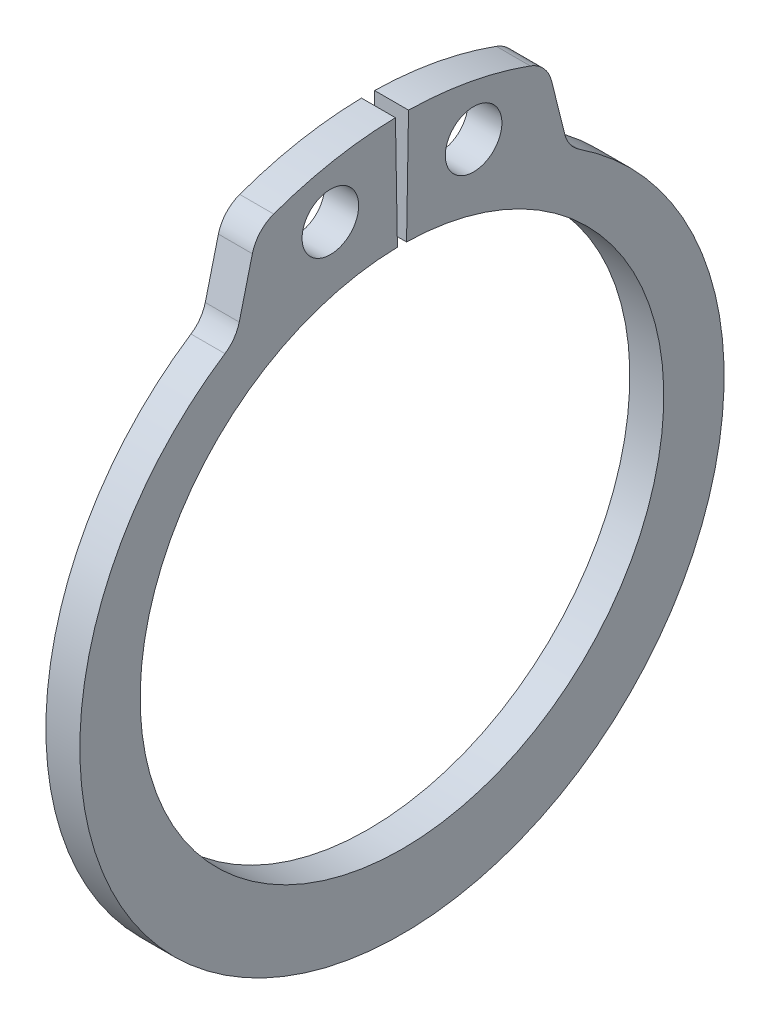
ISO-10303-21;
HEADER;
FILE_DESCRIPTION(('STEP AP214'),'2;1');
FILE_NAME('part.step','',(''),(''),'','','');
FILE_SCHEMA(('AUTOMOTIVE_DESIGN { 1 0 10303 214 1 1 1 1 }'));
ENDSEC;
DATA;
#1=APPLICATION_CONTEXT('core data for automotive mechanical design processes');
#2=APPLICATION_PROTOCOL_DEFINITION('international standard','automotive_design',2000,#1);
#3=PRODUCT_CONTEXT('',#1,'mechanical');
#4=PRODUCT('Part','Part','',(#3));
#5=PRODUCT_RELATED_PRODUCT_CATEGORY('part','',(#4));
#6=PRODUCT_DEFINITION_FORMATION('','',#4);
#7=PRODUCT_DEFINITION_CONTEXT('part definition',#1,'design');
#8=PRODUCT_DEFINITION('design','',#6,#7);
#9=PRODUCT_DEFINITION_SHAPE('','',#8);
#10=(LENGTH_UNIT() NAMED_UNIT(*) SI_UNIT(.MILLI.,.METRE.));
#11=(NAMED_UNIT(*) PLANE_ANGLE_UNIT() SI_UNIT($,.RADIAN.));
#12=(NAMED_UNIT(*) SI_UNIT($,.STERADIAN.) SOLID_ANGLE_UNIT());
#13=UNCERTAINTY_MEASURE_WITH_UNIT(LENGTH_MEASURE(1.E-05),#10,'distance_accuracy_value','');
#14=(GEOMETRIC_REPRESENTATION_CONTEXT(3) GLOBAL_UNCERTAINTY_ASSIGNED_CONTEXT((#13)) GLOBAL_UNIT_ASSIGNED_CONTEXT((#10,
#11,#12)) REPRESENTATION_CONTEXT('',''));
#15=CARTESIAN_POINT('',(0.,0.,0.));
#16=DIRECTION('',(0.,0.,1.));
#17=DIRECTION('',(1.,0.,0.));
#18=AXIS2_PLACEMENT_3D('',#15,#16,#17);
#19=CARTESIAN_POINT('',(0.6,0.,0.));
#20=DIRECTION('',(1.,0.,0.));
#21=DIRECTION('',(0.,0.,-1.));
#22=AXIS2_PLACEMENT_3D('',#19,#20,#21);
#23=PLANE('',#22);
#24=CARTESIAN_POINT('',(0.6,11.2075498339008,2.53014564968776));
#25=DIRECTION('',(1.,0.,0.));
#26=DIRECTION('',(0.,0.,-1.));
#27=AXIS2_PLACEMENT_3D('',#24,#25,#26);
#28=CIRCLE('',#27,1.);
#29=CARTESIAN_POINT('',(0.6,11.2075498339008,1.53014564968776));
#30=VERTEX_POINT('',#29);
#31=EDGE_CURVE('E217',#30,#30,#28,.T.);
#32=ORIENTED_EDGE('',*,*,#31,.F.);
#33=EDGE_LOOP('',(#32));
#34=FACE_BOUND('',#33,.T.);
#35=CARTESIAN_POINT('',(0.6,0.,0.));
#36=DIRECTION('',(1.,0.,0.));
#37=DIRECTION('',(0.,0.,-1.));
#38=AXIS2_PLACEMENT_3D('',#35,#36,#37);
#39=CIRCLE('',#38,13.25);
#40=CARTESIAN_POINT('',(0.6,13.2479819608222,0.231244385294007));
#41=VERTEX_POINT('',#40);
#42=CARTESIAN_POINT('',(0.6,12.4507767148435,4.53218040209241));
#43=VERTEX_POINT('',#42);
#44=EDGE_CURVE('E134',#41,#43,#39,.T.);
#45=ORIENTED_EDGE('',*,*,#44,.T.);
#46=CARTESIAN_POINT('',(0.6,11.3231592010464,4.12171878077083));
#47=DIRECTION('',(1.,0.,0.));
#48=DIRECTION('',(0.,0.,-1.));
#49=AXIS2_PLACEMENT_3D('',#46,#47,#48);
#50=CIRCLE('',#49,1.2);
#51=CARTESIAN_POINT('',(0.6,11.613465475766,5.28607365230203));
#52=VERTEX_POINT('',#51);
#53=EDGE_CURVE('E171',#43,#52,#50,.T.);
#54=ORIENTED_EDGE('',*,*,#53,.T.);
#55=DIRECTION('',(0.,-0.970295726275997,0.241921895599665));
#56=VECTOR('',#55,1.);
#57=CARTESIAN_POINT('',(0.6,12.2139395720065,5.13635864512732));
#58=LINE('',#57,#56);
#59=CARTESIAN_POINT('',(0.6,9.75327839740805,5.74987038146369));
#60=VERTEX_POINT('',#59);
#61=EDGE_CURVE('E209',#52,#60,#58,.T.);
#62=ORIENTED_EDGE('',*,*,#61,.T.);
#63=CARTESIAN_POINT('',(0.6,10.0435846721276,6.91422525299489));
#64=DIRECTION('',(1.,0.,0.));
#65=DIRECTION('',(0.,0.,-1.));
#66=AXIS2_PLACEMENT_3D('',#63,#64,#65);
#67=CIRCLE('',#66,1.2);
#68=CARTESIAN_POINT('',(0.6,9.04102340024933,6.25477783573576));
#69=VERTEX_POINT('',#68);
#70=EDGE_CURVE('E182',#60,#69,#67,.F.);
#71=ORIENTED_EDGE('',*,*,#70,.T.);
#72=CARTESIAN_POINT('',(0.6,-0.468147245038732,0.));
#73=DIRECTION('',(1.,0.,0.));
#74=DIRECTION('',(0.,0.,-1.));
#75=AXIS2_PLACEMENT_3D('',#72,#73,#74);
#76=CIRCLE('',#75,11.3818527549613);
#77=CARTESIAN_POINT('',(0.6,9.04102340024933,-6.25477783573577));
#78=VERTEX_POINT('',#77);
#79=EDGE_CURVE('E204',#69,#78,#76,.T.);
#80=ORIENTED_EDGE('',*,*,#79,.T.);
#81=CARTESIAN_POINT('',(0.6,10.0435846721276,-6.9142252529949));
#82=DIRECTION('',(1.,0.,0.));
#83=DIRECTION('',(0.,0.,-1.));
#84=AXIS2_PLACEMENT_3D('',#81,#82,#83);
#85=CIRCLE('',#84,1.2);
#86=CARTESIAN_POINT('',(0.6,9.75327839740804,-5.7498703814637));
#87=VERTEX_POINT('',#86);
#88=EDGE_CURVE('E11',#78,#87,#85,.F.);
#89=ORIENTED_EDGE('',*,*,#88,.T.);
#90=DIRECTION('',(0.,0.970295726275997,0.241921895599666));
#91=VECTOR('',#90,1.);
#92=CARTESIAN_POINT('',(0.6,12.2139395720065,-5.13635864512732));
#93=LINE('',#92,#91);
#94=CARTESIAN_POINT('',(0.6,11.613465475766,-5.28607365230203));
#95=VERTEX_POINT('',#94);
#96=EDGE_CURVE('E203',#87,#95,#93,.T.);
#97=ORIENTED_EDGE('',*,*,#96,.T.);
#98=CARTESIAN_POINT('',(0.6,11.3231592010464,-4.12171878077084));
#99=DIRECTION('',(1.,0.,0.));
#100=DIRECTION('',(0.,0.,-1.));
#101=AXIS2_PLACEMENT_3D('',#98,#99,#100);
#102=CIRCLE('',#101,1.2);
#103=CARTESIAN_POINT('',(0.6,12.4507767148435,-4.53218040209241));
#104=VERTEX_POINT('',#103);
#105=EDGE_CURVE('E49',#95,#104,#102,.T.);
#106=ORIENTED_EDGE('',*,*,#105,.T.);
#107=CARTESIAN_POINT('',(0.6,0.,0.));
#108=DIRECTION('',(1.,0.,0.));
#109=DIRECTION('',(0.,0.,1.));
#110=AXIS2_PLACEMENT_3D('',#107,#108,#109);
#111=CIRCLE('',#110,13.25);
#112=CARTESIAN_POINT('',(0.6,13.2479819608222,-0.231244385294012));
#113=VERTEX_POINT('',#112);
#114=EDGE_CURVE('E206',#104,#113,#111,.T.);
#115=ORIENTED_EDGE('',*,*,#114,.T.);
#116=DIRECTION('',(0.,-0.999847695156391,0.0174524064372846));
#117=VECTOR('',#116,1.);
#118=CARTESIAN_POINT('',(0.6,13.2479819608222,-0.231244385294011));
#119=LINE('',#118,#117);
#120=CARTESIAN_POINT('',(0.6,9.24859118019662,-0.161434759544873));
#121=VERTEX_POINT('',#120);
#122=EDGE_CURVE('E140',#113,#121,#119,.T.);
#123=ORIENTED_EDGE('',*,*,#122,.T.);
#124=CARTESIAN_POINT('',(0.6,0.,0.));
#125=DIRECTION('',(-1.,0.,0.));
#126=DIRECTION('',(0.,0.,-1.));
#127=AXIS2_PLACEMENT_3D('',#124,#125,#126);
#128=CIRCLE('',#127,9.25);
#129=CARTESIAN_POINT('',(0.6,9.24859118019662,0.161434759544873));
#130=VERTEX_POINT('',#129);
#131=EDGE_CURVE('E135',#121,#130,#128,.T.);
#132=ORIENTED_EDGE('',*,*,#131,.T.);
#133=DIRECTION('',(0.,0.999847695156391,0.0174524064372836));
#134=VECTOR('',#133,1.);
#135=CARTESIAN_POINT('',(0.6,9.24859118019662,0.161434759544873));
#136=LINE('',#135,#134);
#137=EDGE_CURVE('E124',#130,#41,#136,.T.);
#138=ORIENTED_EDGE('',*,*,#137,.T.);
#139=EDGE_LOOP('',(#45,#54,#62,#71,#80,#89,#97,#106,#115,#123,#132,#138));
#140=FACE_BOUND('',#139,.T.);
#141=CARTESIAN_POINT('',(0.6,11.2075498339008,-2.53014564968776));
#142=DIRECTION('',(1.,0.,0.));
#143=DIRECTION('',(0.,0.,-1.));
#144=AXIS2_PLACEMENT_3D('',#141,#142,#143);
#145=CIRCLE('',#144,1.);
#146=CARTESIAN_POINT('',(0.6,11.2075498339008,-3.53014564968776));
#147=VERTEX_POINT('',#146);
#148=EDGE_CURVE('E246',#147,#147,#145,.T.);
#149=ORIENTED_EDGE('',*,*,#148,.F.);
#150=EDGE_LOOP('',(#149));
#151=FACE_BOUND('',#150,.T.);
#152=ADVANCED_FACE('F34',(#34,#140,#151),#23,.T.);
#153=CARTESIAN_POINT('',(-0.6,0.,0.));
#154=DIRECTION('',(1.,0.,0.));
#155=DIRECTION('',(0.,0.,-1.));
#156=AXIS2_PLACEMENT_3D('',#153,#154,#155);
#157=PLANE('',#156);
#158=CARTESIAN_POINT('',(-0.6,11.2075498339008,2.53014564968776));
#159=DIRECTION('',(1.,0.,0.));
#160=DIRECTION('',(0.,0.,-1.));
#161=AXIS2_PLACEMENT_3D('',#158,#159,#160);
#162=CIRCLE('',#161,1.);
#163=CARTESIAN_POINT('',(-0.6,11.2075498339008,1.53014564968776));
#164=VERTEX_POINT('',#163);
#165=EDGE_CURVE('E243',#164,#164,#162,.T.);
#166=ORIENTED_EDGE('',*,*,#165,.T.);
#167=EDGE_LOOP('',(#166));
#168=FACE_BOUND('',#167,.T.);
#169=DIRECTION('',(0.,-0.970295726275997,0.241921895599665));
#170=VECTOR('',#169,1.);
#171=CARTESIAN_POINT('',(-0.6,12.2139395720065,5.13635864512732));
#172=LINE('',#171,#170);
#173=CARTESIAN_POINT('',(-0.6,11.613465475766,5.28607365230203));
#174=VERTEX_POINT('',#173);
#175=CARTESIAN_POINT('',(-0.6,9.75327839740805,5.74987038146369));
#176=VERTEX_POINT('',#175);
#177=EDGE_CURVE('E200',#174,#176,#172,.T.);
#178=ORIENTED_EDGE('',*,*,#177,.F.);
#179=CARTESIAN_POINT('',(-0.6,11.3231592010464,4.12171878077083));
#180=DIRECTION('',(1.,0.,0.));
#181=DIRECTION('',(0.,0.,-1.));
#182=AXIS2_PLACEMENT_3D('',#179,#180,#181);
#183=CIRCLE('',#182,1.2);
#184=CARTESIAN_POINT('',(-0.6,12.4507767148435,4.53218040209241));
#185=VERTEX_POINT('',#184);
#186=EDGE_CURVE('E166',#174,#185,#183,.F.);
#187=ORIENTED_EDGE('',*,*,#186,.T.);
#188=CARTESIAN_POINT('',(-0.6,0.,0.));
#189=DIRECTION('',(1.,0.,0.));
#190=DIRECTION('',(0.,0.,-1.));
#191=AXIS2_PLACEMENT_3D('',#188,#189,#190);
#192=CIRCLE('',#191,13.25);
#193=CARTESIAN_POINT('',(-0.6,13.2479819608222,0.231244385294007));
#194=VERTEX_POINT('',#193);
#195=EDGE_CURVE('E219',#194,#185,#192,.T.);
#196=ORIENTED_EDGE('',*,*,#195,.F.);
#197=DIRECTION('',(0.,0.999847695156391,0.0174524064372836));
#198=VECTOR('',#197,1.);
#199=CARTESIAN_POINT('',(-0.6,9.24859118019662,0.161434759544873));
#200=LINE('',#199,#198);
#201=CARTESIAN_POINT('',(-0.6,9.24859118019662,0.161434759544873));
#202=VERTEX_POINT('',#201);
#203=EDGE_CURVE('E216',#202,#194,#200,.T.);
#204=ORIENTED_EDGE('',*,*,#203,.F.);
#205=CARTESIAN_POINT('',(-0.6,0.,0.));
#206=DIRECTION('',(-1.,0.,0.));
#207=DIRECTION('',(0.,0.,-1.));
#208=AXIS2_PLACEMENT_3D('',#205,#206,#207);
#209=CIRCLE('',#208,9.25);
#210=CARTESIAN_POINT('',(-0.6,9.24859118019662,-0.161434759544873));
#211=VERTEX_POINT('',#210);
#212=EDGE_CURVE('E148',#211,#202,#209,.T.);
#213=ORIENTED_EDGE('',*,*,#212,.F.);
#214=DIRECTION('',(0.,-0.999847695156391,0.0174524064372846));
#215=VECTOR('',#214,1.);
#216=CARTESIAN_POINT('',(-0.6,13.2479819608222,-0.231244385294011));
#217=LINE('',#216,#215);
#218=CARTESIAN_POINT('',(-0.6,13.2479819608222,-0.231244385294012));
#219=VERTEX_POINT('',#218);
#220=EDGE_CURVE('E144',#219,#211,#217,.T.);
#221=ORIENTED_EDGE('',*,*,#220,.F.);
#222=CARTESIAN_POINT('',(-0.6,0.,0.));
#223=DIRECTION('',(1.,0.,0.));
#224=DIRECTION('',(0.,0.,1.));
#225=AXIS2_PLACEMENT_3D('',#222,#223,#224);
#226=CIRCLE('',#225,13.25);
#227=CARTESIAN_POINT('',(-0.6,12.4507767148435,-4.53218040209241));
#228=VERTEX_POINT('',#227);
#229=EDGE_CURVE('E225',#228,#219,#226,.T.);
#230=ORIENTED_EDGE('',*,*,#229,.F.);
#231=CARTESIAN_POINT('',(-0.6,11.3231592010464,-4.12171878077084));
#232=DIRECTION('',(1.,0.,0.));
#233=DIRECTION('',(0.,0.,-1.));
#234=AXIS2_PLACEMENT_3D('',#231,#232,#233);
#235=CIRCLE('',#234,1.2);
#236=CARTESIAN_POINT('',(-0.6,11.613465475766,-5.28607365230203));
#237=VERTEX_POINT('',#236);
#238=EDGE_CURVE('E164',#228,#237,#235,.F.);
#239=ORIENTED_EDGE('',*,*,#238,.T.);
#240=DIRECTION('',(0.,0.970295726275997,0.241921895599666));
#241=VECTOR('',#240,1.);
#242=CARTESIAN_POINT('',(-0.6,12.2139395720065,-5.13635864512732));
#243=LINE('',#242,#241);
#244=CARTESIAN_POINT('',(-0.6,9.75327839740804,-5.7498703814637));
#245=VERTEX_POINT('',#244);
#246=EDGE_CURVE('E191',#245,#237,#243,.T.);
#247=ORIENTED_EDGE('',*,*,#246,.F.);
#248=CARTESIAN_POINT('',(-0.6,10.0435846721276,-6.9142252529949));
#249=DIRECTION('',(1.,0.,0.));
#250=DIRECTION('',(0.,0.,-1.));
#251=AXIS2_PLACEMENT_3D('',#248,#249,#250);
#252=CIRCLE('',#251,1.2);
#253=CARTESIAN_POINT('',(-0.6,9.04102340024933,-6.25477783573577));
#254=VERTEX_POINT('',#253);
#255=EDGE_CURVE('E42',#245,#254,#252,.T.);
#256=ORIENTED_EDGE('',*,*,#255,.T.);
#257=CARTESIAN_POINT('',(-0.6,-0.468147245038732,0.));
#258=DIRECTION('',(1.,0.,0.));
#259=DIRECTION('',(0.,0.,-1.));
#260=AXIS2_PLACEMENT_3D('',#257,#258,#259);
#261=CIRCLE('',#260,11.3818527549613);
#262=CARTESIAN_POINT('',(-0.6,9.04102340024933,6.25477783573576));
#263=VERTEX_POINT('',#262);
#264=EDGE_CURVE('E190',#263,#254,#261,.T.);
#265=ORIENTED_EDGE('',*,*,#264,.F.);
#266=CARTESIAN_POINT('',(-0.6,10.0435846721276,6.91422525299489));
#267=DIRECTION('',(1.,0.,0.));
#268=DIRECTION('',(0.,0.,-1.));
#269=AXIS2_PLACEMENT_3D('',#266,#267,#268);
#270=CIRCLE('',#269,1.2);
#271=EDGE_CURVE('E180',#263,#176,#270,.T.);
#272=ORIENTED_EDGE('',*,*,#271,.T.);
#273=EDGE_LOOP('',(#178,#187,#196,#204,#213,#221,#230,#239,#247,#256,#265,#272));
#274=FACE_BOUND('',#273,.T.);
#275=CARTESIAN_POINT('',(-0.6,11.2075498339008,-2.53014564968776));
#276=DIRECTION('',(1.,0.,0.));
#277=DIRECTION('',(0.,0.,-1.));
#278=AXIS2_PLACEMENT_3D('',#275,#276,#277);
#279=CIRCLE('',#278,1.);
#280=CARTESIAN_POINT('',(-0.6,11.2075498339008,-3.53014564968776));
#281=VERTEX_POINT('',#280);
#282=EDGE_CURVE('E249',#281,#281,#279,.T.);
#283=ORIENTED_EDGE('',*,*,#282,.T.);
#284=EDGE_LOOP('',(#283));
#285=FACE_BOUND('',#284,.T.);
#286=ADVANCED_FACE('F188',(#168,#274,#285),#157,.F.);
#287=CARTESIAN_POINT('',(0.6,0.,0.));
#288=DIRECTION('',(-1.,0.,0.));
#289=DIRECTION('',(0.,0.,1.));
#290=AXIS2_PLACEMENT_3D('',#287,#288,#289);
#291=CYLINDRICAL_SURFACE('',#290,9.25);
#292=ORIENTED_EDGE('',*,*,#212,.T.);
#293=DIRECTION('',(-1.,0.,0.));
#294=VECTOR('',#293,1.);
#295=CARTESIAN_POINT('',(0.6,9.24859118019662,0.161434759544873));
#296=LINE('',#295,#294);
#297=EDGE_CURVE('E128',#130,#202,#296,.T.);
#298=ORIENTED_EDGE('',*,*,#297,.F.);
#299=ORIENTED_EDGE('',*,*,#131,.F.);
#300=DIRECTION('',(-1.,0.,0.));
#301=VECTOR('',#300,1.);
#302=CARTESIAN_POINT('',(0.6,9.24859118019662,-0.161434759544873));
#303=LINE('',#302,#301);
#304=EDGE_CURVE('E214',#121,#211,#303,.T.);
#305=ORIENTED_EDGE('',*,*,#304,.T.);
#306=EDGE_LOOP('',(#292,#298,#299,#305));
#307=FACE_BOUND('',#306,.T.);
#308=ADVANCED_FACE('F146',(#307),#291,.F.);
#309=CARTESIAN_POINT('',(0.6,9.24859118019662,0.161434759544873));
#310=DIRECTION('',(0.,-0.0174524064372835,0.999847695156391));
#311=DIRECTION('',(0.,-0.999847695156391,-0.0174524064372835));
#312=AXIS2_PLACEMENT_3D('',#309,#310,#311);
#313=PLANE('',#312);
#314=ORIENTED_EDGE('',*,*,#203,.T.);
#315=DIRECTION('',(-1.,0.,0.));
#316=VECTOR('',#315,1.);
#317=CARTESIAN_POINT('',(0.6,13.2479819608222,0.231244385294007));
#318=LINE('',#317,#316);
#319=EDGE_CURVE('E131',#41,#194,#318,.T.);
#320=ORIENTED_EDGE('',*,*,#319,.F.);
#321=ORIENTED_EDGE('',*,*,#137,.F.);
#322=ORIENTED_EDGE('',*,*,#297,.T.);
#323=EDGE_LOOP('',(#314,#320,#321,#322));
#324=FACE_BOUND('',#323,.T.);
#325=ADVANCED_FACE('F126',(#324),#313,.F.);
#326=CARTESIAN_POINT('',(0.6,0.,0.));
#327=DIRECTION('',(-1.,0.,0.));
#328=DIRECTION('',(0.,0.,1.));
#329=AXIS2_PLACEMENT_3D('',#326,#327,#328);
#330=CYLINDRICAL_SURFACE('',#329,13.25);
#331=ORIENTED_EDGE('',*,*,#195,.T.);
#332=DIRECTION('',(-1.,0.,0.));
#333=VECTOR('',#332,1.);
#334=CARTESIAN_POINT('',(0.6,12.4507767148435,4.53218040209241));
#335=LINE('',#334,#333);
#336=EDGE_CURVE('E168',#185,#43,#335,.F.);
#337=ORIENTED_EDGE('',*,*,#336,.T.);
#338=ORIENTED_EDGE('',*,*,#44,.F.);
#339=ORIENTED_EDGE('',*,*,#319,.T.);
#340=EDGE_LOOP('',(#331,#337,#338,#339));
#341=FACE_BOUND('',#340,.T.);
#342=ADVANCED_FACE('F237',(#341),#330,.T.);
#343=CARTESIAN_POINT('',(0.6,12.2139395720065,5.13635864512732));
#344=DIRECTION('',(0.,-0.241921895599665,-0.970295726275997));
#345=DIRECTION('',(0.,0.970295726275997,-0.241921895599665));
#346=AXIS2_PLACEMENT_3D('',#343,#344,#345);
#347=PLANE('',#346);
#348=ORIENTED_EDGE('',*,*,#177,.T.);
#349=DIRECTION('',(1.,0.,0.));
#350=VECTOR('',#349,1.);
#351=CARTESIAN_POINT('',(0.6,9.75327839740805,5.74987038146369));
#352=LINE('',#351,#350);
#353=EDGE_CURVE('E162',#176,#60,#352,.T.);
#354=ORIENTED_EDGE('',*,*,#353,.T.);
#355=ORIENTED_EDGE('',*,*,#61,.F.);
#356=DIRECTION('',(-1.,0.,0.));
#357=VECTOR('',#356,1.);
#358=CARTESIAN_POINT('',(0.6,11.613465475766,5.28607365230203));
#359=LINE('',#358,#357);
#360=EDGE_CURVE('E159',#52,#174,#359,.T.);
#361=ORIENTED_EDGE('',*,*,#360,.T.);
#362=EDGE_LOOP('',(#348,#354,#355,#361));
#363=FACE_BOUND('',#362,.T.);
#364=ADVANCED_FACE('F279',(#363),#347,.F.);
#365=CARTESIAN_POINT('',(0.6,-0.468147245038732,0.));
#366=DIRECTION('',(-1.,0.,0.));
#367=DIRECTION('',(0.,0.,1.));
#368=AXIS2_PLACEMENT_3D('',#365,#366,#367);
#369=CYLINDRICAL_SURFACE('',#368,11.3818527549613);
#370=ORIENTED_EDGE('',*,*,#79,.F.);
#371=DIRECTION('',(-1.,0.,0.));
#372=VECTOR('',#371,1.);
#373=CARTESIAN_POINT('',(0.6,9.04102340024933,6.25477783573576));
#374=LINE('',#373,#372);
#375=EDGE_CURVE('E151',#69,#263,#374,.T.);
#376=ORIENTED_EDGE('',*,*,#375,.T.);
#377=ORIENTED_EDGE('',*,*,#264,.T.);
#378=DIRECTION('',(-1.,0.,0.));
#379=VECTOR('',#378,1.);
#380=CARTESIAN_POINT('',(0.6,9.04102340024933,-6.25477783573577));
#381=LINE('',#380,#379);
#382=EDGE_CURVE('E149',#254,#78,#381,.F.);
#383=ORIENTED_EDGE('',*,*,#382,.T.);
#384=EDGE_LOOP('',(#370,#376,#377,#383));
#385=FACE_BOUND('',#384,.T.);
#386=ADVANCED_FACE('F197',(#385),#369,.T.);
#387=CARTESIAN_POINT('',(0.6,12.2139395720065,-5.13635864512732));
#388=DIRECTION('',(0.,-0.241921895599666,0.970295726275997));
#389=DIRECTION('',(0.,-0.970295726275997,-0.241921895599666));
#390=AXIS2_PLACEMENT_3D('',#387,#388,#389);
#391=PLANE('',#390);
#392=ORIENTED_EDGE('',*,*,#246,.T.);
#393=DIRECTION('',(-1.,0.,0.));
#394=VECTOR('',#393,1.);
#395=CARTESIAN_POINT('',(0.6,11.613465475766,-5.28607365230203));
#396=LINE('',#395,#394);
#397=EDGE_CURVE('E57',#237,#95,#396,.F.);
#398=ORIENTED_EDGE('',*,*,#397,.T.);
#399=ORIENTED_EDGE('',*,*,#96,.F.);
#400=DIRECTION('',(1.,0.,0.));
#401=VECTOR('',#400,1.);
#402=CARTESIAN_POINT('',(-0.6,9.75327839740804,-5.7498703814637));
#403=LINE('',#402,#401);
#404=EDGE_CURVE('E176',#87,#245,#403,.F.);
#405=ORIENTED_EDGE('',*,*,#404,.T.);
#406=EDGE_LOOP('',(#392,#398,#399,#405));
#407=FACE_BOUND('',#406,.T.);
#408=ADVANCED_FACE('F205',(#407),#391,.F.);
#409=CARTESIAN_POINT('',(0.6,0.,0.));
#410=DIRECTION('',(-1.,0.,0.));
#411=DIRECTION('',(0.,0.,1.));
#412=AXIS2_PLACEMENT_3D('',#409,#410,#411);
#413=CYLINDRICAL_SURFACE('',#412,13.25);
#414=ORIENTED_EDGE('',*,*,#114,.F.);
#415=DIRECTION('',(-1.,0.,0.));
#416=VECTOR('',#415,1.);
#417=CARTESIAN_POINT('',(0.6,12.4507767148435,-4.53218040209241));
#418=LINE('',#417,#416);
#419=EDGE_CURVE('E173',#104,#228,#418,.T.);
#420=ORIENTED_EDGE('',*,*,#419,.T.);
#421=ORIENTED_EDGE('',*,*,#229,.T.);
#422=DIRECTION('',(-1.,0.,0.));
#423=VECTOR('',#422,1.);
#424=CARTESIAN_POINT('',(0.6,13.2479819608222,-0.231244385294012));
#425=LINE('',#424,#423);
#426=EDGE_CURVE('E153',#113,#219,#425,.T.);
#427=ORIENTED_EDGE('',*,*,#426,.F.);
#428=EDGE_LOOP('',(#414,#420,#421,#427));
#429=FACE_BOUND('',#428,.T.);
#430=ADVANCED_FACE('F272',(#429),#413,.T.);
#431=CARTESIAN_POINT('',(0.6,13.2479819608222,-0.231244385294011));
#432=DIRECTION('',(0.,-0.0174524064372846,-0.999847695156391));
#433=DIRECTION('',(0.,0.999847695156391,-0.0174524064372846));
#434=AXIS2_PLACEMENT_3D('',#431,#432,#433);
#435=PLANE('',#434);
#436=ORIENTED_EDGE('',*,*,#220,.T.);
#437=ORIENTED_EDGE('',*,*,#304,.F.);
#438=ORIENTED_EDGE('',*,*,#122,.F.);
#439=ORIENTED_EDGE('',*,*,#426,.T.);
#440=EDGE_LOOP('',(#436,#437,#438,#439));
#441=FACE_BOUND('',#440,.T.);
#442=ADVANCED_FACE('F232',(#441),#435,.F.);
#443=CARTESIAN_POINT('',(0.6,11.2075498339008,2.53014564968776));
#444=DIRECTION('',(-1.,0.,0.));
#445=DIRECTION('',(0.,0.,1.));
#446=AXIS2_PLACEMENT_3D('',#443,#444,#445);
#447=CYLINDRICAL_SURFACE('',#446,1.);
#448=ORIENTED_EDGE('',*,*,#31,.T.);
#449=EDGE_LOOP('',(#448));
#450=FACE_BOUND('',#449,.T.);
#451=ORIENTED_EDGE('',*,*,#165,.F.);
#452=EDGE_LOOP('',(#451));
#453=FACE_BOUND('',#452,.T.);
#454=ADVANCED_FACE('F267',(#450,#453),#447,.F.);
#455=CARTESIAN_POINT('',(0.6,11.2075498339008,-2.53014564968776));
#456=DIRECTION('',(-1.,0.,0.));
#457=DIRECTION('',(0.,0.,1.));
#458=AXIS2_PLACEMENT_3D('',#455,#456,#457);
#459=CYLINDRICAL_SURFACE('',#458,1.);
#460=ORIENTED_EDGE('',*,*,#148,.T.);
#461=EDGE_LOOP('',(#460));
#462=FACE_BOUND('',#461,.T.);
#463=ORIENTED_EDGE('',*,*,#282,.F.);
#464=EDGE_LOOP('',(#463));
#465=FACE_BOUND('',#464,.T.);
#466=ADVANCED_FACE('F255',(#462,#465),#459,.F.);
#467=CARTESIAN_POINT('',(0.6,10.0435846721276,6.91422525299489));
#468=DIRECTION('',(-1.,0.,0.));
#469=DIRECTION('',(0.,0.,1.));
#470=AXIS2_PLACEMENT_3D('',#467,#468,#469);
#471=CYLINDRICAL_SURFACE('',#470,1.2);
#472=ORIENTED_EDGE('',*,*,#70,.F.);
#473=ORIENTED_EDGE('',*,*,#353,.F.);
#474=ORIENTED_EDGE('',*,*,#271,.F.);
#475=ORIENTED_EDGE('',*,*,#375,.F.);
#476=EDGE_LOOP('',(#472,#473,#474,#475));
#477=FACE_BOUND('',#476,.T.);
#478=ADVANCED_FACE('F289',(#477),#471,.F.);
#479=CARTESIAN_POINT('',(0.6,11.3231592010464,4.12171878077083));
#480=DIRECTION('',(-1.,0.,0.));
#481=DIRECTION('',(0.,0.,1.));
#482=AXIS2_PLACEMENT_3D('',#479,#480,#481);
#483=CYLINDRICAL_SURFACE('',#482,1.2);
#484=ORIENTED_EDGE('',*,*,#53,.F.);
#485=ORIENTED_EDGE('',*,*,#336,.F.);
#486=ORIENTED_EDGE('',*,*,#186,.F.);
#487=ORIENTED_EDGE('',*,*,#360,.F.);
#488=EDGE_LOOP('',(#484,#485,#486,#487));
#489=FACE_BOUND('',#488,.T.);
#490=ADVANCED_FACE('F292',(#489),#483,.T.);
#491=CARTESIAN_POINT('',(0.6,11.3231592010464,-4.12171878077084));
#492=DIRECTION('',(-1.,0.,0.));
#493=DIRECTION('',(0.,0.,1.));
#494=AXIS2_PLACEMENT_3D('',#491,#492,#493);
#495=CYLINDRICAL_SURFACE('',#494,1.2);
#496=ORIENTED_EDGE('',*,*,#105,.F.);
#497=ORIENTED_EDGE('',*,*,#397,.F.);
#498=ORIENTED_EDGE('',*,*,#238,.F.);
#499=ORIENTED_EDGE('',*,*,#419,.F.);
#500=EDGE_LOOP('',(#496,#497,#498,#499));
#501=FACE_BOUND('',#500,.T.);
#502=ADVANCED_FACE('F295',(#501),#495,.T.);
#503=CARTESIAN_POINT('',(0.6,10.0435846721276,-6.9142252529949));
#504=DIRECTION('',(-1.,0.,0.));
#505=DIRECTION('',(0.,0.,1.));
#506=AXIS2_PLACEMENT_3D('',#503,#504,#505);
#507=CYLINDRICAL_SURFACE('',#506,1.2);
#508=ORIENTED_EDGE('',*,*,#88,.F.);
#509=ORIENTED_EDGE('',*,*,#382,.F.);
#510=ORIENTED_EDGE('',*,*,#255,.F.);
#511=ORIENTED_EDGE('',*,*,#404,.F.);
#512=EDGE_LOOP('',(#508,#509,#510,#511));
#513=FACE_BOUND('',#512,.T.);
#514=ADVANCED_FACE('F36',(#513),#507,.F.);
#515=CLOSED_SHELL('',(#152,#286,#308,#325,#342,#364,#386,#408,#430,#442,#454,#466,#478,#490,
#502,#514));
#516=MANIFOLD_SOLID_BREP('B2',#515);
#517=ADVANCED_BREP_SHAPE_REPRESENTATION('',(#18,#516),#14);
#518=SHAPE_DEFINITION_REPRESENTATION(#9,#517);
ENDSEC;
END-ISO-10303-21;
